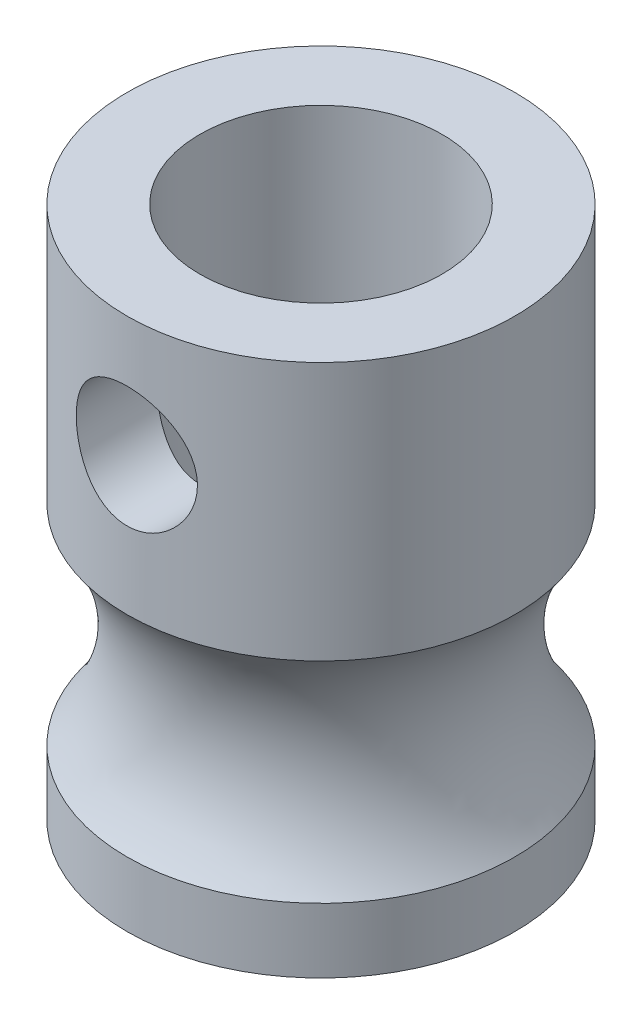
ISO-10303-21;
HEADER;
FILE_DESCRIPTION(('STEP AP214'),'2;1');
FILE_NAME('part.step','',(''),(''),'','','');
FILE_SCHEMA(('AUTOMOTIVE_DESIGN { 1 0 10303 214 1 1 1 1 }'));
ENDSEC;
DATA;
#1=APPLICATION_CONTEXT('core data for automotive mechanical design processes');
#2=APPLICATION_PROTOCOL_DEFINITION('international standard','automotive_design',2000,#1);
#3=PRODUCT_CONTEXT('',#1,'mechanical');
#4=PRODUCT('Part','Part','',(#3));
#5=PRODUCT_RELATED_PRODUCT_CATEGORY('part','',(#4));
#6=PRODUCT_DEFINITION_FORMATION('','',#4);
#7=PRODUCT_DEFINITION_CONTEXT('part definition',#1,'design');
#8=PRODUCT_DEFINITION('design','',#6,#7);
#9=PRODUCT_DEFINITION_SHAPE('','',#8);
#10=(LENGTH_UNIT() NAMED_UNIT(*) SI_UNIT(.MILLI.,.METRE.));
#11=(NAMED_UNIT(*) PLANE_ANGLE_UNIT() SI_UNIT($,.RADIAN.));
#12=(NAMED_UNIT(*) SI_UNIT($,.STERADIAN.) SOLID_ANGLE_UNIT());
#13=UNCERTAINTY_MEASURE_WITH_UNIT(LENGTH_MEASURE(1.E-05),#10,'distance_accuracy_value','');
#14=(GEOMETRIC_REPRESENTATION_CONTEXT(3) GLOBAL_UNCERTAINTY_ASSIGNED_CONTEXT((#13)) GLOBAL_UNIT_ASSIGNED_CONTEXT((#10,
#11,#12)) REPRESENTATION_CONTEXT('',''));
#15=CARTESIAN_POINT('',(0.,0.,0.));
#16=DIRECTION('',(0.,0.,1.));
#17=DIRECTION('',(1.,0.,0.));
#18=AXIS2_PLACEMENT_3D('',#15,#16,#17);
#19=CARTESIAN_POINT('',(0.,11.,0.));
#20=DIRECTION('',(0.,-1.,0.));
#21=DIRECTION('',(0.,0.,-1.));
#22=AXIS2_PLACEMENT_3D('',#19,#20,#21);
#23=CYLINDRICAL_SURFACE('',#22,4.);
#24=CARTESIAN_POINT('',(0.,11.,0.));
#25=DIRECTION('',(0.,1.,0.));
#26=DIRECTION('',(0.,0.,1.));
#27=AXIS2_PLACEMENT_3D('',#24,#25,#26);
#28=CIRCLE('',#27,4.);
#29=CARTESIAN_POINT('',(0.,11.,4.));
#30=VERTEX_POINT('',#29);
#31=EDGE_CURVE('E10',#30,#30,#28,.T.);
#32=ORIENTED_EDGE('',*,*,#31,.F.);
#33=EDGE_LOOP('',(#32));
#34=FACE_BOUND('',#33,.T.);
#35=CARTESIAN_POINT('',(1.25,8.5,3.79967103839267));
#36=CARTESIAN_POINT('',(1.24999953780047,8.43165296389066,3.79967145961936));
#37=CARTESIAN_POINT('',(1.24437538791494,8.3633012312968,3.80153531505043));
#38=CARTESIAN_POINT('',(1.22209175401327,8.22860583912219,3.80875638998877));
#39=CARTESIAN_POINT('',(1.20542928782515,8.16226272726784,3.81411455353136));
#40=CARTESIAN_POINT('',(1.16169788223559,8.033555098068,3.8276593883596));
#41=CARTESIAN_POINT('',(1.13464735736677,7.97118376689432,3.83584105194317));
#42=CARTESIAN_POINT('',(1.07096914173157,7.85184730413599,3.85410406218688));
#43=CARTESIAN_POINT('',(1.03433975905632,7.79488313003988,3.86418574435841));
#44=CARTESIAN_POINT('',(0.951196070622294,7.68602113250651,3.8855012766862));
#45=CARTESIAN_POINT('',(0.904409399720399,7.63433639056402,3.8967612338478));
#46=CARTESIAN_POINT('',(0.802862046455496,7.53940398679082,3.91894245860335));
#47=CARTESIAN_POINT('',(0.748100252518566,7.49615750305515,3.92986367872627));
#48=CARTESIAN_POINT('',(0.630625912493364,7.41838893698876,3.95043553390078));
#49=CARTESIAN_POINT('',(0.567761556520096,7.38408629616854,3.9600518456278));
#50=CARTESIAN_POINT('',(0.436804232853405,7.32662395014445,3.97662551833019));
#51=CARTESIAN_POINT('',(0.368712498487053,7.30346162585041,3.98358350419919));
#52=CARTESIAN_POINT('',(0.231464356966099,7.26964887190293,3.99387175820863));
#53=CARTESIAN_POINT('',(0.162405715468217,7.25863425021215,3.99730738984143));
#54=CARTESIAN_POINT('',(0.0233408139845221,7.24827565356247,4.00053595876015));
#55=CARTESIAN_POINT('',(-0.0466652269730815,7.24892902564117,4.00032972410065));
#56=CARTESIAN_POINT('',(-0.183074480354733,7.26164829158594,3.99637116132537));
#57=CARTESIAN_POINT('',(-0.249518634314042,7.27331938351302,3.99274150972157));
#58=CARTESIAN_POINT('',(-0.379453063347768,7.307094990043,3.98249482560855));
#59=CARTESIAN_POINT('',(-0.442943145481194,7.32920018508655,3.97587759827134));
#60=CARTESIAN_POINT('',(-0.566078103154779,7.38347018907488,3.96023459729533));
#61=CARTESIAN_POINT('',(-0.625666405622829,7.41575480856303,3.95118033616957));
#62=CARTESIAN_POINT('',(-0.738702511152028,7.48937109970456,3.93161722953562));
#63=CARTESIAN_POINT('',(-0.792148756208836,7.53070505913783,3.92110801644584));
#64=CARTESIAN_POINT('',(-0.893737698453879,7.62327363480129,3.89923670734646));
#65=CARTESIAN_POINT('',(-0.941566549094176,7.6748490688412,3.88785731989084));
#66=CARTESIAN_POINT('',(-1.02798974259537,7.78539510182446,3.86590615440412));
#67=CARTESIAN_POINT('',(-1.06658299775341,7.844366570575,3.85533447159847));
#68=CARTESIAN_POINT('',(-1.13380465019765,7.96891746885984,3.83610846648974));
#69=CARTESIAN_POINT('',(-1.16231680702682,8.03456340904239,3.82747690354324));
#70=CARTESIAN_POINT('',(-1.20778345948513,8.17005949189535,3.81337545338913));
#71=CARTESIAN_POINT('',(-1.22474210765793,8.23990811421048,3.80790443033294));
#72=CARTESIAN_POINT('',(-1.24601485185709,8.37881995256583,3.80099563391872));
#73=CARTESIAN_POINT('',(-1.25080954353711,8.4478019962321,3.79940466389696));
#74=CARTESIAN_POINT('',(-1.24896744498307,8.58558974149816,3.80001077463984));
#75=CARTESIAN_POINT('',(-1.24233242111456,8.65439546870046,3.80220727008389));
#76=CARTESIAN_POINT('',(-1.21824873513143,8.78780829665164,3.80998957482874));
#77=CARTESIAN_POINT('',(-1.20111831160538,8.85247927407399,3.81547554101732));
#78=CARTESIAN_POINT('',(-1.15690373661028,8.97802179199604,3.82911287331661));
#79=CARTESIAN_POINT('',(-1.12981796171155,9.03889271092119,3.83726467412388));
#80=CARTESIAN_POINT('',(-1.06557510655875,9.15703910977175,3.85560539653156));
#81=CARTESIAN_POINT('',(-1.02815147488557,9.21416141559277,3.86584603489733));
#82=CARTESIAN_POINT('',(-0.944606408679812,9.32149034636191,3.88710348972828));
#83=CARTESIAN_POINT('',(-0.898482714690784,9.37169516892533,3.89812050735703));
#84=CARTESIAN_POINT('',(-0.796572947753606,9.46591036591281,3.92024187562679));
#85=CARTESIAN_POINT('',(-0.740465649788522,9.50957778613986,3.93133092285679));
#86=CARTESIAN_POINT('',(-0.621451545651399,9.58689104332125,3.95189059843678));
#87=CARTESIAN_POINT('',(-0.558545051108625,9.62053733931103,3.96136130090946));
#88=CARTESIAN_POINT('',(-0.428105523331833,9.67653056247168,3.97756311928512));
#89=CARTESIAN_POINT('',(-0.360610184283757,9.69895928784368,3.984313995612));
#90=CARTESIAN_POINT('',(-0.22255725405639,9.7320725385897,3.99440242648576));
#91=CARTESIAN_POINT('',(-0.152000628340358,9.74276073908349,3.99774104914277));
#92=CARTESIAN_POINT('',(-0.0129849366489001,9.75179100174962,4.00055803404462));
#93=CARTESIAN_POINT('',(0.055439191946521,9.75062845017075,4.0001912940739));
#94=CARTESIAN_POINT('',(0.191073221923247,9.7371881889513,3.99600978081049));
#95=CARTESIAN_POINT('',(0.258283202179567,9.72491120400805,3.99219523232619));
#96=CARTESIAN_POINT('',(0.38875511848079,9.68990599077772,3.98159570844796));
#97=CARTESIAN_POINT('',(0.452055918449479,9.66731039215463,3.97484847960205));
#98=CARTESIAN_POINT('',(0.573998425500089,9.61242917279152,3.9590794558795));
#99=CARTESIAN_POINT('',(0.63263933127448,9.58014189002657,3.95005727091358));
#100=CARTESIAN_POINT('',(0.745761694969687,9.50552724165556,3.93029896883376));
#101=CARTESIAN_POINT('',(0.800034607053109,9.46289647753603,3.91951509750962));
#102=CARTESIAN_POINT('',(0.900820791399317,9.36934011055654,3.89758736547061));
#103=CARTESIAN_POINT('',(0.947331733504159,9.31841202586061,3.88644339784827));
#104=CARTESIAN_POINT('',(1.03282865911252,9.2076842801589,3.86461892577438));
#105=CARTESIAN_POINT('',(1.07151427994711,9.14764659688342,3.85396600863456));
#106=CARTESIAN_POINT('',(1.13820470748521,9.02160187973086,3.83480125279531));
#107=CARTESIAN_POINT('',(1.16621383403546,8.95559727354975,3.82628854861387));
#108=CARTESIAN_POINT('',(1.20871180435792,8.82527738268533,3.81306560440328));
#109=CARTESIAN_POINT('',(1.22414939837873,8.76129745254843,3.80809315043749));
#110=CARTESIAN_POINT('',(1.244792458161,8.63154616790351,3.80139606482399));
#111=CARTESIAN_POINT('',(1.25000044480778,8.5657752587985,3.79967063301598));
#112=CARTESIAN_POINT('',(1.25,8.5,3.79967103839267));
#113=B_SPLINE_CURVE_WITH_KNOTS('',3,(#35,#36,#37,#38,#39,#40,#41,#42,#43,#44,#45,#46,#47,#48,
#49,#50,#51,#52,#53,#54,#55,#56,#57,#58,#59,#60,#61,#62,#63,#64,#65,#66,#67,#68,#69,#70,#71,#72,
#73,#74,#75,#76,#77,#78,#79,#80,#81,#82,#83,#84,#85,#86,#87,#88,#89,#90,#91,#92,#93,#94,#95,#96,
#97,#98,#99,#100,#101,#102,#103,#104,#105,#106,#107,#108,#109,#110,#111,#112),.UNSPECIFIED.,.T.,
.F.,(4,2,2,2,2,2,2,2,2,2,2,2,2,2,2,2,2,2,2,2,2,2,2,2,2,2,2,2,2,2,2,2,2,2,2,2,2,2,4),(0.,
0.204798137548489,0.409651627059734,0.614143644118581,0.818671804924946,1.02957080550838,
1.24049922941122,1.45619821963733,1.67184647417922,1.88083722835533,2.08978046471774,
2.2915098296975,2.49325235190093,2.69746404608409,2.90172742713187,3.11450338937334,
3.32730439853776,3.54248470934454,3.75758763952752,3.96404933287935,4.17047912219089,
4.37093972044363,4.5714330225321,4.77767613309611,4.9839728801188,5.19881937811511,
5.41365603317086,5.62690239290998,5.84008198140585,6.04438802439525,6.24868074692307,
6.45041846514759,6.65219079911652,6.86080693105215,7.0694855777219,7.28507795501705,
7.50058300803822,7.69772354371386,7.89481549188779),.UNSPECIFIED.);
#114=CARTESIAN_POINT('',(1.25,8.5,3.79967103839267));
#115=VERTEX_POINT('',#114);
#116=EDGE_CURVE('E56',#115,#115,#113,.T.);
#117=ORIENTED_EDGE('',*,*,#116,.T.);
#118=EDGE_LOOP('',(#117));
#119=FACE_BOUND('',#118,.T.);
#120=CARTESIAN_POINT('',(0.,5.6650635094611,0.));
#121=DIRECTION('',(0.,-1.,0.));
#122=DIRECTION('',(0.,0.,-1.));
#123=AXIS2_PLACEMENT_3D('',#120,#121,#122);
#124=CIRCLE('',#123,4.);
#125=CARTESIAN_POINT('',(0.,5.6650635094611,-4.));
#126=VERTEX_POINT('',#125);
#127=EDGE_CURVE('E33',#126,#126,#124,.T.);
#128=ORIENTED_EDGE('',*,*,#127,.F.);
#129=EDGE_LOOP('',(#128));
#130=FACE_BOUND('',#129,.T.);
#131=ADVANCED_FACE('F29',(#34,#119,#130),#23,.T.);
#132=CARTESIAN_POINT('',(0.,0.,0.));
#133=DIRECTION('',(0.,1.,0.));
#134=DIRECTION('',(0.,0.,1.));
#135=AXIS2_PLACEMENT_3D('',#132,#133,#134);
#136=CIRCLE('',#135,4.);
#137=CARTESIAN_POINT('',(0.,0.,4.));
#138=VERTEX_POINT('',#137);
#139=EDGE_CURVE('E37',#138,#138,#136,.T.);
#140=ORIENTED_EDGE('',*,*,#139,.T.);
#141=EDGE_LOOP('',(#140));
#142=FACE_BOUND('',#141,.T.);
#143=CARTESIAN_POINT('',(0.,1.3349364905389,0.));
#144=DIRECTION('',(0.,1.,0.));
#145=DIRECTION('',(0.,0.,1.));
#146=AXIS2_PLACEMENT_3D('',#143,#144,#145);
#147=CIRCLE('',#146,4.);
#148=CARTESIAN_POINT('',(0.,1.3349364905389,4.));
#149=VERTEX_POINT('',#148);
#150=EDGE_CURVE('E47',#149,#149,#147,.T.);
#151=ORIENTED_EDGE('',*,*,#150,.F.);
#152=EDGE_LOOP('',(#151));
#153=FACE_BOUND('',#152,.T.);
#154=ADVANCED_FACE('F81',(#142,#153),#23,.T.);
#155=CARTESIAN_POINT('',(0.,11.,0.));
#156=DIRECTION('',(0.,1.,0.));
#157=DIRECTION('',(0.,0.,1.));
#158=AXIS2_PLACEMENT_3D('',#155,#156,#157);
#159=PLANE('',#158);
#160=ORIENTED_EDGE('',*,*,#31,.T.);
#161=EDGE_LOOP('',(#160));
#162=FACE_BOUND('',#161,.T.);
#163=CARTESIAN_POINT('',(0.,11.,0.));
#164=DIRECTION('',(0.,1.,0.));
#165=DIRECTION('',(0.,0.,1.));
#166=AXIS2_PLACEMENT_3D('',#163,#164,#165);
#167=CIRCLE('',#166,2.5);
#168=CARTESIAN_POINT('',(0.,11.,2.5));
#169=VERTEX_POINT('',#168);
#170=EDGE_CURVE('E42',#169,#169,#167,.T.);
#171=ORIENTED_EDGE('',*,*,#170,.F.);
#172=EDGE_LOOP('',(#171));
#173=FACE_BOUND('',#172,.T.);
#174=ADVANCED_FACE('F86',(#162,#173),#159,.T.);
#175=CARTESIAN_POINT('',(0.,0.,0.));
#176=DIRECTION('',(0.,1.,0.));
#177=DIRECTION('',(0.,0.,1.));
#178=AXIS2_PLACEMENT_3D('',#175,#176,#177);
#179=PLANE('',#178);
#180=ORIENTED_EDGE('',*,*,#139,.F.);
#181=EDGE_LOOP('',(#180));
#182=FACE_BOUND('',#181,.T.);
#183=CARTESIAN_POINT('',(0.,0.,0.));
#184=DIRECTION('',(0.,1.,0.));
#185=DIRECTION('',(0.,0.,1.));
#186=AXIS2_PLACEMENT_3D('',#183,#184,#185);
#187=CIRCLE('',#186,2.5);
#188=CARTESIAN_POINT('',(0.,0.,2.5));
#189=VERTEX_POINT('',#188);
#190=EDGE_CURVE('E45',#189,#189,#187,.T.);
#191=ORIENTED_EDGE('',*,*,#190,.T.);
#192=EDGE_LOOP('',(#191));
#193=FACE_BOUND('',#192,.T.);
#194=ADVANCED_FACE('F95',(#182,#193),#179,.F.);
#195=CARTESIAN_POINT('',(0.,11.,0.));
#196=DIRECTION('',(0.,-1.,0.));
#197=DIRECTION('',(0.,0.,-1.));
#198=AXIS2_PLACEMENT_3D('',#195,#196,#197);
#199=CYLINDRICAL_SURFACE('',#198,2.5);
#200=CARTESIAN_POINT('',(1.25,8.5,2.1650635094611));
#201=CARTESIAN_POINT('',(1.24999545384316,8.43486523975594,2.16506918410574));
#202=CARTESIAN_POINT('',(1.24487496341652,8.36964823559369,2.16804751484696));
#203=CARTESIAN_POINT('',(1.22465401237257,8.24121591915356,2.17952958065065));
#204=CARTESIAN_POINT('',(1.20953258069272,8.17800510619574,2.18804492569449));
#205=CARTESIAN_POINT('',(1.17012493587476,8.05568541957007,2.20936683256748));
#206=CARTESIAN_POINT('',(1.14588744061716,7.99655668440801,2.22215054341565));
#207=CARTESIAN_POINT('',(1.08908440672046,7.8832197475041,2.25053331021072));
#208=CARTESIAN_POINT('',(1.05651841754472,7.82901181217193,2.26613251845081));
#209=CARTESIAN_POINT('',(0.980833175663598,7.72211783930312,2.29996086321802));
#210=CARTESIAN_POINT('',(0.937065045179713,7.66992608040807,2.31830079547442));
#211=CARTESIAN_POINT('',(0.841567259518085,7.57323951449161,2.35464978482132));
#212=CARTESIAN_POINT('',(0.789833657227866,7.5287485467706,2.37265867289062));
#213=CARTESIAN_POINT('',(0.675611954268182,7.44579106106542,2.40776846191186));
#214=CARTESIAN_POINT('',(0.612633986265718,7.40793279017559,2.42472633022716));
#215=CARTESIAN_POINT('',(0.48019628324938,7.3435739334428,2.45438445124411));
#216=CARTESIAN_POINT('',(0.410740672672694,7.31706617982854,2.46708738979677));
#217=CARTESIAN_POINT('',(0.272556179907471,7.27811917337363,2.48600576555297));
#218=CARTESIAN_POINT('',(0.204127238111022,7.26481309205558,2.49261850276115));
#219=CARTESIAN_POINT('',(0.0657132858723101,7.2497923516562,2.50009479807584));
#220=CARTESIAN_POINT('',(-0.00427075730467304,7.24807067900536,2.50096183480737));
#221=CARTESIAN_POINT('',(-0.137290655529687,7.25593334246294,2.49703727395563));
#222=CARTESIAN_POINT('',(-0.200401498970989,7.26454751940153,2.492731198652));
#223=CARTESIAN_POINT('',(-0.324142214897902,7.29110105488082,2.47967806574684));
#224=CARTESIAN_POINT('',(-0.384771901367407,7.30904111122028,2.47093067582992));
#225=CARTESIAN_POINT('',(-0.502886739461942,7.35385320761227,2.44964479109568));
#226=CARTESIAN_POINT('',(-0.560316779393973,7.38084539146508,2.43705551911499));
#227=CARTESIAN_POINT('',(-0.66997100189166,7.44282927025187,2.40922057483359));
#228=CARTESIAN_POINT('',(-0.722193311048307,7.47782382912794,2.39397395196855));
#229=CARTESIAN_POINT('',(-0.825217076122743,7.55861918941627,2.36055492999036));
#230=CARTESIAN_POINT('',(-0.8754175937867,7.60512878540751,2.34224219997719));
#231=CARTESIAN_POINT('',(-0.967630462872225,7.70573715616272,2.30567925733515));
#232=CARTESIAN_POINT('',(-1.00963651446779,7.75984171534258,2.28742910332036));
#233=CARTESIAN_POINT('',(-1.08688166830276,7.87831024053011,2.25180195115606));
#234=CARTESIAN_POINT('',(-1.12152164372256,7.94310752881776,2.23455399988384));
#235=CARTESIAN_POINT('',(-1.17914889125154,8.07867208919875,2.2046931284822));
#236=CARTESIAN_POINT('',(-1.20214832276361,8.14943304127195,2.19207537557584));
#237=CARTESIAN_POINT('',(-1.2339752637813,8.28901813910349,2.17430794771293));
#238=CARTESIAN_POINT('',(-1.24378140264997,8.35755139880444,2.1686456981062));
#239=CARTESIAN_POINT('',(-1.25189618326428,8.49550167689568,2.16397399202012));
#240=CARTESIAN_POINT('',(-1.25021294664378,8.56491803639973,2.16495983611639));
#241=CARTESIAN_POINT('',(-1.23629505417996,8.69456739822341,2.17292920675731));
#242=CARTESIAN_POINT('',(-1.22523477089058,8.75497431388491,2.17924484383318));
#243=CARTESIAN_POINT('',(-1.19462035579055,8.8729597328387,2.19617526939176));
#244=CARTESIAN_POINT('',(-1.17506347327952,8.93053731343326,2.20679145006292));
#245=CARTESIAN_POINT('',(-1.12705948575611,9.04426416362837,2.23170277599571));
#246=CARTESIAN_POINT('',(-1.0982425796159,9.10022377106694,2.24614554053829));
#247=CARTESIAN_POINT('',(-1.03285883001976,9.20683658942374,2.27695149371562));
#248=CARTESIAN_POINT('',(-0.99628800541527,9.2574870543916,2.29331566693934));
#249=CARTESIAN_POINT('',(-0.911046458998566,9.35872345940443,2.3285999807042));
#250=CARTESIAN_POINT('',(-0.861431590393707,9.40849643839707,2.34758228942861));
#251=CARTESIAN_POINT('',(-0.75425561924786,9.49926529749199,2.38417793722366));
#252=CARTESIAN_POINT('',(-0.696691843319183,9.54025821278817,2.40179081259637));
#253=CARTESIAN_POINT('',(-0.573169203198446,9.61321715743763,2.43426702113696));
#254=CARTESIAN_POINT('',(-0.507028871967641,9.64491639776364,2.44904552090037));
#255=CARTESIAN_POINT('',(-0.369402955801352,9.69642237982174,2.47354193699126));
#256=CARTESIAN_POINT('',(-0.29792212674022,9.71623956420788,2.48326429595466));
#257=CARTESIAN_POINT('',(-0.158724602913021,9.74171070521833,2.49584385227353));
#258=CARTESIAN_POINT('',(-0.0912643048130712,9.74849734484514,2.49924909885239));
#259=CARTESIAN_POINT('',(0.0439074824390046,9.751054081818,2.50052662968914));
#260=CARTESIAN_POINT('',(0.111618875368858,9.74682803565445,2.49840085083612));
#261=CARTESIAN_POINT('',(0.240672490396434,9.72822949150547,2.48917461047403));
#262=CARTESIAN_POINT('',(0.302140397264079,9.71454393842791,2.48241118334987));
#263=CARTESIAN_POINT('',(0.421807440229521,9.67834125087129,2.46490117079279));
#264=CARTESIAN_POINT('',(0.480006106194386,9.65582284988318,2.45415401415995));
#265=CARTESIAN_POINT('',(0.594279257806106,9.60159118479253,2.4290741343515));
#266=CARTESIAN_POINT('',(0.650156428375058,9.5695258459902,2.41460771498499));
#267=CARTESIAN_POINT('',(0.755968302267531,9.49755258642618,2.38360166427283));
#268=CARTESIAN_POINT('',(0.805900259268634,9.45764106360541,2.36706108197951));
#269=CARTESIAN_POINT('',(0.903642505196114,9.36650357622162,2.33160762783285));
#270=CARTESIAN_POINT('',(0.95074710567409,9.31454689065351,2.31262248764622));
#271=CARTESIAN_POINT('',(1.03582910924334,9.20318659858779,2.27578845203565));
#272=CARTESIAN_POINT('',(1.07379843751257,9.14377647391539,2.25794057202332));
#273=CARTESIAN_POINT('',(1.14053884973207,9.0167041917738,2.22499506631145));
#274=CARTESIAN_POINT('',(1.16898133245117,8.94884058608908,2.21000217820338));
#275=CARTESIAN_POINT('',(1.21359838688301,8.80833449457528,2.18582695410439));
#276=CARTESIAN_POINT('',(1.22981398896918,8.73570888885914,2.17662520184627));
#277=CARTESIAN_POINT('',(1.24295875983052,8.635243305435,2.16911590752238));
#278=CARTESIAN_POINT('',(1.24559513120481,8.60829013200264,2.1676016125644));
#279=CARTESIAN_POINT('',(1.24911675636245,8.55422939914719,2.16557419859688));
#280=CARTESIAN_POINT('',(1.25000189299984,8.52712182951766,2.16506114656387));
#281=CARTESIAN_POINT('',(1.25,8.5,2.1650635094611));
#282=B_SPLINE_CURVE_WITH_KNOTS('',3,(#200,#201,#202,#203,#204,#205,#206,#207,#208,#209,#210,
#211,#212,#213,#214,#215,#216,#217,#218,#219,#220,#221,#222,#223,#224,#225,#226,#227,#228,#229,
#230,#231,#232,#233,#234,#235,#236,#237,#238,#239,#240,#241,#242,#243,#244,#245,#246,#247,#248,
#249,#250,#251,#252,#253,#254,#255,#256,#257,#258,#259,#260,#261,#262,#263,#264,#265,#266,#267,
#268,#269,#270,#271,#272,#273,#274,#275,#276,#277,#278,#279,#280,#281),.UNSPECIFIED.,.T.,.F.,(4,
2,2,2,2,2,2,2,2,2,2,2,2,2,2,2,2,2,2,2,2,2,2,2,2,2,2,2,2,2,2,2,2,2,2,2,2,2,2,2,4),(0.,
0.195290153243392,0.390991116031006,0.585660744898609,0.780340906806437,0.991077890622793,
1.20191963855464,1.42697365298454,1.65188533704864,1.86079356209919,2.0695752960755,
2.26020121855673,2.45084140646819,2.64411918413933,2.8374662418784,3.04908989321113,
3.26087560307398,3.4861105216181,3.71110967764631,3.91827863567765,4.12530116485466,
4.30967729280032,4.49411315545079,4.68709120507609,4.88016857775059,5.09758429475766,
5.31507331222753,5.53830226766207,5.76133474760964,5.96390337986858,6.16640108492464,
6.35555531089365,6.54473666890016,6.7420093839934,6.93937287625899,7.15637802312584,
7.37357428556443,7.59763436298256,7.8209391625345,7.90225168981636,7.98356965618175),.UNSPECIFIED.);
#283=CARTESIAN_POINT('',(1.25,8.5,2.1650635094611));
#284=VERTEX_POINT('',#283);
#285=EDGE_CURVE('E52',#284,#284,#282,.T.);
#286=ORIENTED_EDGE('',*,*,#285,.F.);
#287=EDGE_LOOP('',(#286));
#288=FACE_BOUND('',#287,.T.);
#289=ORIENTED_EDGE('',*,*,#170,.T.);
#290=EDGE_LOOP('',(#289));
#291=FACE_BOUND('',#290,.T.);
#292=ORIENTED_EDGE('',*,*,#190,.F.);
#293=EDGE_LOOP('',(#292));
#294=FACE_BOUND('',#293,.T.);
#295=ADVANCED_FACE('F75',(#288,#291,#294),#199,.F.);
#296=CARTESIAN_POINT('',(0.,8.5,4.));
#297=DIRECTION('',(0.,0.,1.));
#298=DIRECTION('',(1.,0.,0.));
#299=AXIS2_PLACEMENT_3D('',#296,#297,#298);
#300=CYLINDRICAL_SURFACE('',#299,1.25);
#301=ORIENTED_EDGE('',*,*,#285,.T.);
#302=EDGE_LOOP('',(#301));
#303=FACE_BOUND('',#302,.T.);
#304=ORIENTED_EDGE('',*,*,#116,.F.);
#305=EDGE_LOOP('',(#304));
#306=FACE_BOUND('',#305,.T.);
#307=ADVANCED_FACE('F70',(#303,#306),#300,.F.);
#308=CARTESIAN_POINT('',(0.,3.5,0.));
#309=DIRECTION('',(0.,1.,0.));
#310=DIRECTION('',(0.,0.,1.));
#311=AXIS2_PLACEMENT_3D('',#308,#309,#310);
#312=TOROIDAL_SURFACE('',#311,6.75,3.5);
#313=ORIENTED_EDGE('',*,*,#150,.T.);
#314=EDGE_LOOP('',(#313));
#315=FACE_BOUND('',#314,.T.);
#316=ORIENTED_EDGE('',*,*,#127,.T.);
#317=EDGE_LOOP('',(#316));
#318=FACE_BOUND('',#317,.T.);
#319=ADVANCED_FACE('F74',(#315,#318),#312,.F.);
#320=CLOSED_SHELL('',(#131,#154,#174,#194,#295,#307,#319));
#321=MANIFOLD_SOLID_BREP('B2',#320);
#322=ADVANCED_BREP_SHAPE_REPRESENTATION('',(#18,#321),#14);
#323=SHAPE_DEFINITION_REPRESENTATION(#9,#322);
ENDSEC;
END-ISO-10303-21;
